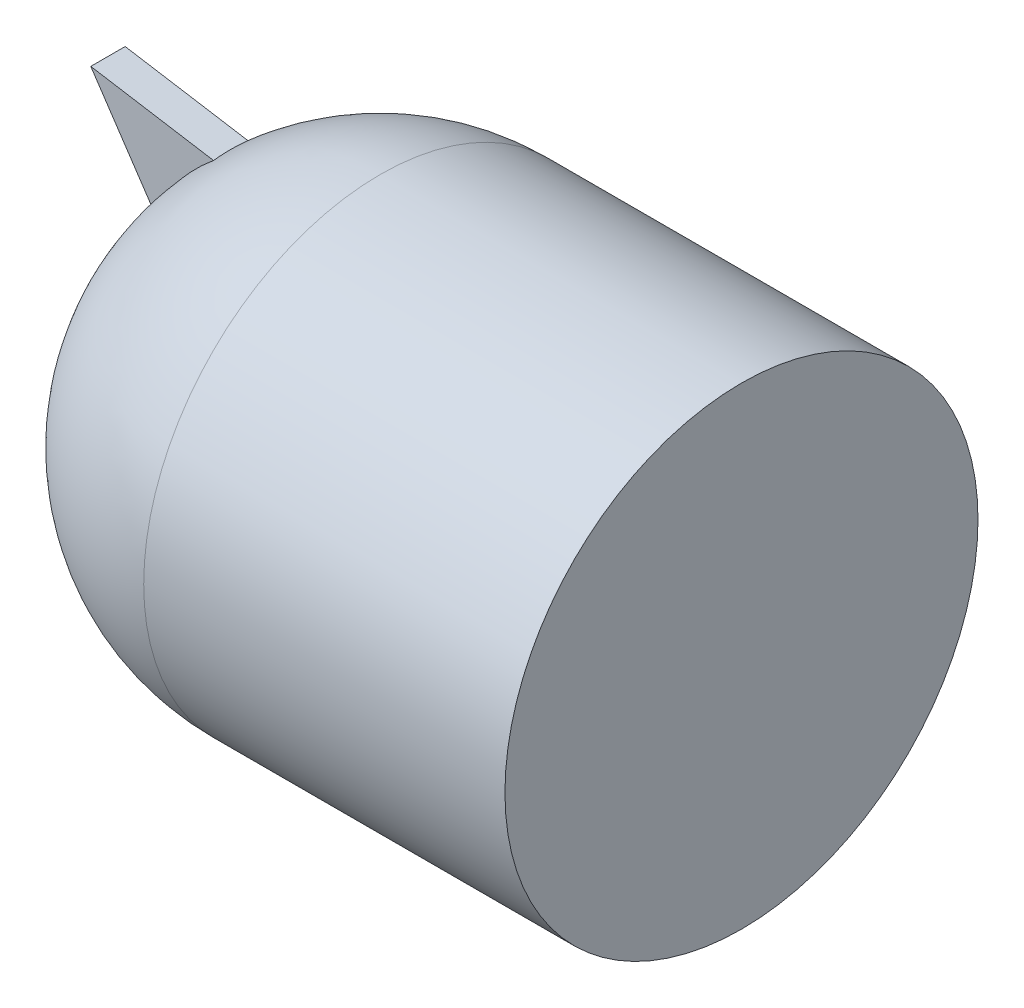
ISO-10303-21;
HEADER;
FILE_DESCRIPTION(('STEP AP214'),'2;1');
FILE_NAME('part.step','',(''),(''),'','','');
FILE_SCHEMA(('AUTOMOTIVE_DESIGN { 1 0 10303 214 1 1 1 1 }'));
ENDSEC;
DATA;
#1=APPLICATION_CONTEXT('core data for automotive mechanical design processes');
#2=APPLICATION_PROTOCOL_DEFINITION('international standard','automotive_design',2000,#1);
#3=PRODUCT_CONTEXT('',#1,'mechanical');
#4=PRODUCT('Part','Part','',(#3));
#5=PRODUCT_RELATED_PRODUCT_CATEGORY('part','',(#4));
#6=PRODUCT_DEFINITION_FORMATION('','',#4);
#7=PRODUCT_DEFINITION_CONTEXT('part definition',#1,'design');
#8=PRODUCT_DEFINITION('design','',#6,#7);
#9=PRODUCT_DEFINITION_SHAPE('','',#8);
#10=(LENGTH_UNIT() NAMED_UNIT(*) SI_UNIT(.MILLI.,.METRE.));
#11=(NAMED_UNIT(*) PLANE_ANGLE_UNIT() SI_UNIT($,.RADIAN.));
#12=(NAMED_UNIT(*) SI_UNIT($,.STERADIAN.) SOLID_ANGLE_UNIT());
#13=UNCERTAINTY_MEASURE_WITH_UNIT(LENGTH_MEASURE(1.E-05),#10,'distance_accuracy_value','');
#14=(GEOMETRIC_REPRESENTATION_CONTEXT(3) GLOBAL_UNCERTAINTY_ASSIGNED_CONTEXT((#13)) GLOBAL_UNIT_ASSIGNED_CONTEXT((#10,
#11,#12)) REPRESENTATION_CONTEXT('',''));
#15=CARTESIAN_POINT('',(0.,0.,0.));
#16=DIRECTION('',(0.,0.,1.));
#17=DIRECTION('',(1.,0.,0.));
#18=AXIS2_PLACEMENT_3D('',#15,#16,#17);
#19=CARTESIAN_POINT('',(-200.,0.,0.));
#20=DIRECTION('',(1.,0.,0.));
#21=DIRECTION('',(0.,1.,0.));
#22=AXIS2_PLACEMENT_3D('',#19,#20,#21);
#23=SPHERICAL_SURFACE('',#22,137.5);
#24=CARTESIAN_POINT('',(-200.,0.,-10.));
#25=DIRECTION('',(0.,0.,-1.));
#26=DIRECTION('',(-1.,0.,0.));
#27=AXIS2_PLACEMENT_3D('',#24,#25,#26);
#28=CIRCLE('',#27,137.135881519025);
#29=CARTESIAN_POINT('',(-286.906992822898,106.082159661655,-10.));
#30=VERTEX_POINT('',#29);
#31=CARTESIAN_POINT('',(-321.664631557291,63.2769107023147,-10.));
#32=VERTEX_POINT('',#31);
#33=EDGE_CURVE('E252',#30,#32,#28,.F.);
#34=ORIENTED_EDGE('',*,*,#33,.F.);
#35=CARTESIAN_POINT('',(-185.340871409232,89.4345588531978,0.));
#36=DIRECTION('',(0.161750586731724,0.986831671407005,0.));
#37=DIRECTION('',(-0.986831671407005,0.161750586731724,0.));
#38=AXIS2_PLACEMENT_3D('',#35,#36,#37);
#39=CIRCLE('',#38,103.406090882951);
#40=CARTESIAN_POINT('',(-286.906992822898,106.082159661655,10.));
#41=VERTEX_POINT('',#40);
#42=EDGE_CURVE('E255',#41,#30,#39,.F.);
#43=ORIENTED_EDGE('',*,*,#42,.F.);
#44=CARTESIAN_POINT('',(-200.,0.,10.));
#45=DIRECTION('',(0.,0.,-1.));
#46=DIRECTION('',(-1.,0.,0.));
#47=AXIS2_PLACEMENT_3D('',#44,#45,#46);
#48=CIRCLE('',#47,137.135881519025);
#49=CARTESIAN_POINT('',(-321.664631557291,63.2769107023147,10.));
#50=VERTEX_POINT('',#49);
#51=EDGE_CURVE('E248',#41,#50,#48,.F.);
#52=ORIENTED_EDGE('',*,*,#51,.T.);
#53=CARTESIAN_POINT('',(-254.551730415217,-36.6412396356591,0.));
#54=DIRECTION('',(-0.830124994956736,-0.557577342391241,0.));
#55=DIRECTION('',(0.557577342391242,-0.830124994956736,0.));
#56=AXIS2_PLACEMENT_3D('',#53,#54,#55);
#57=CIRCLE('',#56,120.779875255225);
#58=EDGE_CURVE('E258',#32,#50,#57,.F.);
#59=ORIENTED_EDGE('',*,*,#58,.F.);
#60=EDGE_LOOP('',(#34,#43,#52,#59));
#61=FACE_BOUND('',#60,.T.);
#62=CARTESIAN_POINT('',(-200.,0.,-10.));
#63=DIRECTION('',(0.,0.,-1.));
#64=DIRECTION('',(-1.,0.,0.));
#65=AXIS2_PLACEMENT_3D('',#62,#63,#64);
#66=CIRCLE('',#65,137.135881519025);
#67=CARTESIAN_POINT('',(-321.664631557291,-63.2769107023148,-10.));
#68=VERTEX_POINT('',#67);
#69=CARTESIAN_POINT('',(-286.906992822898,-106.082159661655,-10.));
#70=VERTEX_POINT('',#69);
#71=EDGE_CURVE('E239',#68,#70,#66,.F.);
#72=ORIENTED_EDGE('',*,*,#71,.F.);
#73=CARTESIAN_POINT('',(-254.551730415217,36.641239635659,0.));
#74=DIRECTION('',(-0.830124994956736,0.557577342391241,0.));
#75=DIRECTION('',(-0.557577342391241,-0.830124994956736,0.));
#76=AXIS2_PLACEMENT_3D('',#73,#74,#75);
#77=CIRCLE('',#76,120.779875255225);
#78=CARTESIAN_POINT('',(-321.664631557291,-63.2769107023148,10.));
#79=VERTEX_POINT('',#78);
#80=EDGE_CURVE('E245',#79,#68,#77,.F.);
#81=ORIENTED_EDGE('',*,*,#80,.F.);
#82=CARTESIAN_POINT('',(-200.,0.,10.));
#83=DIRECTION('',(0.,0.,-1.));
#84=DIRECTION('',(-1.,0.,0.));
#85=AXIS2_PLACEMENT_3D('',#82,#83,#84);
#86=CIRCLE('',#85,137.135881519025);
#87=CARTESIAN_POINT('',(-286.906992822898,-106.082159661655,10.));
#88=VERTEX_POINT('',#87);
#89=EDGE_CURVE('E200',#79,#88,#86,.F.);
#90=ORIENTED_EDGE('',*,*,#89,.T.);
#91=CARTESIAN_POINT('',(-185.340871409232,-89.4345588531979,0.));
#92=DIRECTION('',(0.161750586731724,-0.986831671407005,0.));
#93=DIRECTION('',(0.986831671407005,0.161750586731724,0.));
#94=AXIS2_PLACEMENT_3D('',#91,#92,#93);
#95=CIRCLE('',#94,103.406090882951);
#96=EDGE_CURVE('E242',#70,#88,#95,.F.);
#97=ORIENTED_EDGE('',*,*,#96,.F.);
#98=EDGE_LOOP('',(#72,#81,#90,#97));
#99=FACE_BOUND('',#98,.T.);
#100=CARTESIAN_POINT('',(-200.,0.,0.));
#101=DIRECTION('',(1.,0.,0.));
#102=DIRECTION('',(0.,1.,0.));
#103=AXIS2_PLACEMENT_3D('',#100,#101,#102);
#104=CIRCLE('',#103,137.5);
#105=CARTESIAN_POINT('',(-200.,137.5,0.));
#106=VERTEX_POINT('',#105);
#107=EDGE_CURVE('E261',#106,#106,#104,.T.);
#108=ORIENTED_EDGE('',*,*,#107,.F.);
#109=EDGE_LOOP('',(#108));
#110=FACE_BOUND('',#109,.T.);
#111=ADVANCED_FACE('F46',(#61,#99,#110),#23,.T.);
#112=CARTESIAN_POINT('',(9.99999999999999,127.5,0.));
#113=DIRECTION('',(1.,0.,0.));
#114=DIRECTION('',(0.,1.,0.));
#115=AXIS2_PLACEMENT_3D('',#112,#113,#114);
#116=PLANE('',#115);
#117=CARTESIAN_POINT('',(10.,0.,0.));
#118=DIRECTION('',(1.,0.,0.));
#119=DIRECTION('',(0.,1.,0.));
#120=AXIS2_PLACEMENT_3D('',#117,#118,#119);
#121=CIRCLE('',#120,137.5);
#122=CARTESIAN_POINT('',(10.,137.5,0.));
#123=VERTEX_POINT('',#122);
#124=EDGE_CURVE('E265',#123,#123,#121,.T.);
#125=ORIENTED_EDGE('',*,*,#124,.T.);
#126=EDGE_LOOP('',(#125));
#127=FACE_BOUND('',#126,.T.);
#128=ADVANCED_FACE('F338',(#127),#116,.T.);
#129=CARTESIAN_POINT('',(0.,0.,0.));
#130=DIRECTION('',(1.,0.,0.));
#131=DIRECTION('',(0.,1.,0.));
#132=AXIS2_PLACEMENT_3D('',#129,#130,#131);
#133=CYLINDRICAL_SURFACE('',#132,137.5);
#134=ORIENTED_EDGE('',*,*,#107,.T.);
#135=EDGE_LOOP('',(#134));
#136=FACE_BOUND('',#135,.T.);
#137=ORIENTED_EDGE('',*,*,#124,.F.);
#138=EDGE_LOOP('',(#137));
#139=FACE_BOUND('',#138,.T.);
#140=ADVANCED_FACE('F341',(#136,#139),#133,.T.);
#141=CARTESIAN_POINT('',(-302.602669679641,-34.8973303203591,-10.));
#142=DIRECTION('',(-0.830124994956736,0.557577342391241,0.));
#143=DIRECTION('',(-0.557577342391241,-0.830124994956736,0.));
#144=AXIS2_PLACEMENT_3D('',#141,#142,#143);
#145=PLANE('',#144);
#146=DIRECTION('',(-0.557577342391241,-0.830124994956736,0.));
#147=VECTOR('',#146,1.);
#148=CARTESIAN_POINT('',(-302.602669679641,-34.8973303203591,10.));
#149=LINE('',#148,#147);
#150=CARTESIAN_POINT('',(-358.272990838099,-117.779688618336,10.));
#151=VERTEX_POINT('',#150);
#152=EDGE_CURVE('E182',#79,#151,#149,.T.);
#153=ORIENTED_EDGE('',*,*,#152,.F.);
#154=ORIENTED_EDGE('',*,*,#80,.T.);
#155=DIRECTION('',(-0.557577342391241,-0.830124994956736,0.));
#156=VECTOR('',#155,1.);
#157=CARTESIAN_POINT('',(-302.602669679641,-34.8973303203591,-10.));
#158=LINE('',#157,#156);
#159=CARTESIAN_POINT('',(-358.272990838099,-117.779688618336,-10.));
#160=VERTEX_POINT('',#159);
#161=EDGE_CURVE('E224',#68,#160,#158,.T.);
#162=ORIENTED_EDGE('',*,*,#161,.T.);
#163=DIRECTION('',(0.,0.,1.));
#164=VECTOR('',#163,1.);
#165=CARTESIAN_POINT('',(-358.272990838099,-117.779688618336,-10.));
#166=LINE('',#165,#164);
#167=EDGE_CURVE('E204',#160,#151,#166,.T.);
#168=ORIENTED_EDGE('',*,*,#167,.T.);
#169=EDGE_LOOP('',(#153,#154,#162,#168));
#170=FACE_BOUND('',#169,.T.);
#171=ADVANCED_FACE('F345',(#170),#145,.T.);
#172=CARTESIAN_POINT('',(-358.272990838099,-117.779688618336,-10.));
#173=DIRECTION('',(0.161750586731724,-0.986831671407005,0.));
#174=DIRECTION('',(0.986831671407005,0.161750586731724,0.));
#175=AXIS2_PLACEMENT_3D('',#172,#173,#174);
#176=PLANE('',#175);
#177=DIRECTION('',(0.986831671407005,0.161750586731724,0.));
#178=VECTOR('',#177,1.);
#179=CARTESIAN_POINT('',(-358.272990838099,-117.779688618336,-10.));
#180=LINE('',#179,#178);
#181=EDGE_CURVE('E220',#160,#70,#180,.T.);
#182=ORIENTED_EDGE('',*,*,#181,.T.);
#183=ORIENTED_EDGE('',*,*,#96,.T.);
#184=DIRECTION('',(0.986831671407005,0.161750586731724,0.));
#185=VECTOR('',#184,1.);
#186=CARTESIAN_POINT('',(-358.272990838099,-117.779688618336,10.));
#187=LINE('',#186,#185);
#188=EDGE_CURVE('E70',#151,#88,#187,.T.);
#189=ORIENTED_EDGE('',*,*,#188,.F.);
#190=ORIENTED_EDGE('',*,*,#167,.F.);
#191=EDGE_LOOP('',(#182,#183,#189,#190));
#192=FACE_BOUND('',#191,.T.);
#193=ADVANCED_FACE('F355',(#192),#176,.T.);
#194=CARTESIAN_POINT('',(0.,0.,-10.));
#195=DIRECTION('',(0.,0.,-1.));
#196=DIRECTION('',(-1.,0.,0.));
#197=AXIS2_PLACEMENT_3D('',#194,#195,#196);
#198=PLANE('',#197);
#199=ORIENTED_EDGE('',*,*,#161,.F.);
#200=ORIENTED_EDGE('',*,*,#71,.T.);
#201=ORIENTED_EDGE('',*,*,#181,.F.);
#202=EDGE_LOOP('',(#199,#200,#201));
#203=FACE_BOUND('',#202,.T.);
#204=ADVANCED_FACE('F351',(#203),#198,.T.);
#205=CARTESIAN_POINT('',(0.,0.,10.));
#206=DIRECTION('',(0.,0.,-1.));
#207=DIRECTION('',(-1.,0.,0.));
#208=AXIS2_PLACEMENT_3D('',#205,#206,#207);
#209=PLANE('',#208);
#210=ORIENTED_EDGE('',*,*,#89,.F.);
#211=ORIENTED_EDGE('',*,*,#152,.T.);
#212=ORIENTED_EDGE('',*,*,#188,.T.);
#213=EDGE_LOOP('',(#210,#211,#212));
#214=FACE_BOUND('',#213,.T.);
#215=ADVANCED_FACE('F347',(#214),#209,.F.);
#216=CARTESIAN_POINT('',(-302.602669679641,34.8973303203591,-10.));
#217=DIRECTION('',(-0.830124994956736,-0.557577342391241,0.));
#218=DIRECTION('',(0.557577342391242,-0.830124994956736,0.));
#219=AXIS2_PLACEMENT_3D('',#216,#217,#218);
#220=PLANE('',#219);
#221=DIRECTION('',(0.557577342391241,-0.830124994956736,0.));
#222=VECTOR('',#221,1.);
#223=CARTESIAN_POINT('',(-302.602669679641,34.8973303203591,-10.));
#224=LINE('',#223,#222);
#225=CARTESIAN_POINT('',(-358.272990838099,117.779688618336,-10.));
#226=VERTEX_POINT('',#225);
#227=EDGE_CURVE('E160',#226,#32,#224,.T.);
#228=ORIENTED_EDGE('',*,*,#227,.T.);
#229=ORIENTED_EDGE('',*,*,#58,.T.);
#230=DIRECTION('',(0.557577342391241,-0.830124994956736,0.));
#231=VECTOR('',#230,1.);
#232=CARTESIAN_POINT('',(-302.602669679641,34.8973303203591,10.));
#233=LINE('',#232,#231);
#234=CARTESIAN_POINT('',(-358.272990838099,117.779688618336,10.));
#235=VERTEX_POINT('',#234);
#236=EDGE_CURVE('E62',#235,#50,#233,.T.);
#237=ORIENTED_EDGE('',*,*,#236,.F.);
#238=DIRECTION('',(0.,0.,1.));
#239=VECTOR('',#238,1.);
#240=CARTESIAN_POINT('',(-358.272990838099,117.779688618336,-10.));
#241=LINE('',#240,#239);
#242=EDGE_CURVE('E159',#226,#235,#241,.T.);
#243=ORIENTED_EDGE('',*,*,#242,.F.);
#244=EDGE_LOOP('',(#228,#229,#237,#243));
#245=FACE_BOUND('',#244,.T.);
#246=ADVANCED_FACE('F350',(#245),#220,.T.);
#247=CARTESIAN_POINT('',(-358.272990838099,117.779688618336,-10.));
#248=DIRECTION('',(0.161750586731724,0.986831671407005,0.));
#249=DIRECTION('',(-0.986831671407005,0.161750586731724,0.));
#250=AXIS2_PLACEMENT_3D('',#247,#248,#249);
#251=PLANE('',#250);
#252=DIRECTION('',(-0.986831671407005,0.161750586731724,0.));
#253=VECTOR('',#252,1.);
#254=CARTESIAN_POINT('',(-358.272990838099,117.779688618336,10.));
#255=LINE('',#254,#253);
#256=EDGE_CURVE('E171',#41,#235,#255,.T.);
#257=ORIENTED_EDGE('',*,*,#256,.F.);
#258=ORIENTED_EDGE('',*,*,#42,.T.);
#259=DIRECTION('',(-0.986831671407005,0.161750586731724,0.));
#260=VECTOR('',#259,1.);
#261=CARTESIAN_POINT('',(-358.272990838099,117.779688618336,-10.));
#262=LINE('',#261,#260);
#263=EDGE_CURVE('E189',#30,#226,#262,.T.);
#264=ORIENTED_EDGE('',*,*,#263,.T.);
#265=ORIENTED_EDGE('',*,*,#242,.T.);
#266=EDGE_LOOP('',(#257,#258,#264,#265));
#267=FACE_BOUND('',#266,.T.);
#268=ADVANCED_FACE('F317',(#267),#251,.T.);
#269=CARTESIAN_POINT('',(0.,0.,-10.));
#270=DIRECTION('',(0.,0.,-1.));
#271=DIRECTION('',(-1.,0.,0.));
#272=AXIS2_PLACEMENT_3D('',#269,#270,#271);
#273=PLANE('',#272);
#274=ORIENTED_EDGE('',*,*,#263,.F.);
#275=ORIENTED_EDGE('',*,*,#33,.T.);
#276=ORIENTED_EDGE('',*,*,#227,.F.);
#277=EDGE_LOOP('',(#274,#275,#276));
#278=FACE_BOUND('',#277,.T.);
#279=ADVANCED_FACE('F310',(#278),#273,.T.);
#280=CARTESIAN_POINT('',(0.,0.,10.));
#281=DIRECTION('',(0.,0.,-1.));
#282=DIRECTION('',(-1.,0.,0.));
#283=AXIS2_PLACEMENT_3D('',#280,#281,#282);
#284=PLANE('',#283);
#285=ORIENTED_EDGE('',*,*,#51,.F.);
#286=ORIENTED_EDGE('',*,*,#256,.T.);
#287=ORIENTED_EDGE('',*,*,#236,.T.);
#288=EDGE_LOOP('',(#285,#286,#287));
#289=FACE_BOUND('',#288,.T.);
#290=ADVANCED_FACE('F319',(#289),#284,.F.);
#291=CLOSED_SHELL('',(#111,#128,#140,#171,#193,#204,#215,#246,#268,#279,#290));
#292=CARTESIAN_POINT('',(-200.,0.,0.));
#293=DIRECTION('',(1.,0.,0.));
#294=DIRECTION('',(0.,1.,0.));
#295=AXIS2_PLACEMENT_3D('',#292,#293,#294);
#296=SPHERICAL_SURFACE('',#295,127.5);
#297=CARTESIAN_POINT('',(-185.340871409232,89.4345588531978,0.));
#298=DIRECTION('',(0.161750586731724,0.986831671407005,0.));
#299=DIRECTION('',(-0.986831671407005,0.161750586731724,0.));
#300=AXIS2_PLACEMENT_3D('',#297,#298,#299);
#301=CIRCLE('',#300,89.6817686695195);
#302=CARTESIAN_POINT('',(-273.289774970515,103.8501751793,10.));
#303=VERTEX_POINT('',#302);
#304=CARTESIAN_POINT('',(-273.289774970515,103.8501751793,-10.));
#305=VERTEX_POINT('',#304);
#306=EDGE_CURVE('E166',#303,#305,#301,.F.);
#307=ORIENTED_EDGE('',*,*,#306,.T.);
#308=CARTESIAN_POINT('',(-200.,0.,-10.));
#309=DIRECTION('',(0.,0.,-1.));
#310=DIRECTION('',(-1.,0.,0.));
#311=AXIS2_PLACEMENT_3D('',#308,#309,#310);
#312=CIRCLE('',#311,127.107238188862);
#313=CARTESIAN_POINT('',(-315.217012034306,53.6776502642081,-10.));
#314=VERTEX_POINT('',#313);
#315=EDGE_CURVE('E11',#305,#314,#312,.F.);
#316=ORIENTED_EDGE('',*,*,#315,.T.);
#317=CARTESIAN_POINT('',(-254.551730415217,-36.6412396356591,0.));
#318=DIRECTION('',(-0.830124994956736,-0.557577342391241,0.));
#319=DIRECTION('',(0.557577342391242,-0.830124994956736,0.));
#320=AXIS2_PLACEMENT_3D('',#317,#318,#319);
#321=CIRCLE('',#320,109.260140337946);
#322=CARTESIAN_POINT('',(-315.217012034306,53.6776502642081,10.));
#323=VERTEX_POINT('',#322);
#324=EDGE_CURVE('E55',#314,#323,#321,.F.);
#325=ORIENTED_EDGE('',*,*,#324,.T.);
#326=CARTESIAN_POINT('',(-200.,0.,10.));
#327=DIRECTION('',(0.,0.,-1.));
#328=DIRECTION('',(-1.,0.,0.));
#329=AXIS2_PLACEMENT_3D('',#326,#327,#328);
#330=CIRCLE('',#329,127.107238188862);
#331=EDGE_CURVE('E290',#303,#323,#330,.F.);
#332=ORIENTED_EDGE('',*,*,#331,.F.);
#333=EDGE_LOOP('',(#307,#316,#325,#332));
#334=FACE_BOUND('',#333,.T.);
#335=CARTESIAN_POINT('',(-254.551730415217,36.641239635659,0.));
#336=DIRECTION('',(-0.830124994956736,0.557577342391241,0.));
#337=DIRECTION('',(-0.557577342391241,-0.830124994956736,0.));
#338=AXIS2_PLACEMENT_3D('',#335,#336,#337);
#339=CIRCLE('',#338,109.260140337946);
#340=CARTESIAN_POINT('',(-315.217012034306,-53.6776502642082,10.));
#341=VERTEX_POINT('',#340);
#342=CARTESIAN_POINT('',(-315.217012034306,-53.6776502642082,-10.));
#343=VERTEX_POINT('',#342);
#344=EDGE_CURVE('E284',#341,#343,#339,.F.);
#345=ORIENTED_EDGE('',*,*,#344,.T.);
#346=CARTESIAN_POINT('',(-200.,0.,-10.));
#347=DIRECTION('',(0.,0.,-1.));
#348=DIRECTION('',(-1.,0.,0.));
#349=AXIS2_PLACEMENT_3D('',#346,#347,#348);
#350=CIRCLE('',#349,127.107238188862);
#351=CARTESIAN_POINT('',(-273.289774970515,-103.8501751793,-10.));
#352=VERTEX_POINT('',#351);
#353=EDGE_CURVE('E287',#343,#352,#350,.F.);
#354=ORIENTED_EDGE('',*,*,#353,.T.);
#355=CARTESIAN_POINT('',(-185.340871409232,-89.4345588531979,0.));
#356=DIRECTION('',(0.161750586731724,-0.986831671407005,0.));
#357=DIRECTION('',(0.986831671407005,0.161750586731724,0.));
#358=AXIS2_PLACEMENT_3D('',#355,#356,#357);
#359=CIRCLE('',#358,89.6817686695196);
#360=CARTESIAN_POINT('',(-273.289774970515,-103.8501751793,10.));
#361=VERTEX_POINT('',#360);
#362=EDGE_CURVE('E281',#352,#361,#359,.F.);
#363=ORIENTED_EDGE('',*,*,#362,.T.);
#364=CARTESIAN_POINT('',(-200.,0.,10.));
#365=DIRECTION('',(0.,0.,-1.));
#366=DIRECTION('',(-1.,0.,0.));
#367=AXIS2_PLACEMENT_3D('',#364,#365,#366);
#368=CIRCLE('',#367,127.107238188862);
#369=EDGE_CURVE('E277',#341,#361,#368,.F.);
#370=ORIENTED_EDGE('',*,*,#369,.F.);
#371=EDGE_LOOP('',(#345,#354,#363,#370));
#372=FACE_BOUND('',#371,.T.);
#373=CARTESIAN_POINT('',(-200.,0.,0.));
#374=DIRECTION('',(1.,0.,0.));
#375=DIRECTION('',(0.,1.,0.));
#376=AXIS2_PLACEMENT_3D('',#373,#374,#375);
#377=CIRCLE('',#376,127.5);
#378=CARTESIAN_POINT('',(-200.,127.5,0.));
#379=VERTEX_POINT('',#378);
#380=EDGE_CURVE('E273',#379,#379,#377,.T.);
#381=ORIENTED_EDGE('',*,*,#380,.T.);
#382=EDGE_LOOP('',(#381));
#383=FACE_BOUND('',#382,.T.);
#384=ADVANCED_FACE('F297',(#334,#372,#383),#296,.F.);
#385=CARTESIAN_POINT('',(0.,0.,0.));
#386=DIRECTION('',(1.,0.,0.));
#387=DIRECTION('',(0.,1.,0.));
#388=AXIS2_PLACEMENT_3D('',#385,#386,#387);
#389=CYLINDRICAL_SURFACE('',#388,127.5);
#390=ORIENTED_EDGE('',*,*,#380,.F.);
#391=EDGE_LOOP('',(#390));
#392=FACE_BOUND('',#391,.T.);
#393=CARTESIAN_POINT('',(0.,0.,0.));
#394=DIRECTION('',(1.,0.,0.));
#395=DIRECTION('',(0.,1.,0.));
#396=AXIS2_PLACEMENT_3D('',#393,#394,#395);
#397=CIRCLE('',#396,127.5);
#398=CARTESIAN_POINT('',(0.,127.5,0.));
#399=VERTEX_POINT('',#398);
#400=EDGE_CURVE('E269',#399,#399,#397,.T.);
#401=ORIENTED_EDGE('',*,*,#400,.T.);
#402=EDGE_LOOP('',(#401));
#403=FACE_BOUND('',#402,.T.);
#404=ADVANCED_FACE('F324',(#392,#403),#389,.F.);
#405=CARTESIAN_POINT('',(0.,127.5,0.));
#406=DIRECTION('',(1.,0.,0.));
#407=DIRECTION('',(0.,1.,0.));
#408=AXIS2_PLACEMENT_3D('',#405,#406,#407);
#409=PLANE('',#408);
#410=ORIENTED_EDGE('',*,*,#400,.F.);
#411=EDGE_LOOP('',(#410));
#412=FACE_BOUND('',#411,.T.);
#413=ADVANCED_FACE('F330',(#412),#409,.F.);
#414=CARTESIAN_POINT('',(-239.232172231446,-98.2678277685545,-10.));
#415=DIRECTION('',(0.707106781186548,0.707106781186547,0.));
#416=DIRECTION('',(-0.707106781186547,0.707106781186548,0.));
#417=AXIS2_PLACEMENT_3D('',#414,#415,#416);
#418=PLANE('',#417);
#419=DIRECTION('',(0.,0.,1.));
#420=VECTOR('',#419,1.);
#421=CARTESIAN_POINT('',(-302.602669679641,-34.8973303203591,-10.));
#422=LINE('',#421,#420);
#423=CARTESIAN_POINT('',(-302.602669679641,-34.8973303203591,-10.));
#424=VERTEX_POINT('',#423);
#425=CARTESIAN_POINT('',(-302.602669679641,-34.8973303203591,10.));
#426=VERTEX_POINT('',#425);
#427=EDGE_CURVE('E213',#424,#426,#422,.T.);
#428=ORIENTED_EDGE('',*,*,#427,.T.);
#429=DIRECTION('',(-0.707106781186547,0.707106781186548,0.));
#430=VECTOR('',#429,1.);
#431=CARTESIAN_POINT('',(-239.232172231446,-98.2678277685545,10.));
#432=LINE('',#431,#430);
#433=CARTESIAN_POINT('',(-239.232172231446,-98.2678277685545,10.));
#434=VERTEX_POINT('',#433);
#435=EDGE_CURVE('E229',#434,#426,#432,.T.);
#436=ORIENTED_EDGE('',*,*,#435,.F.);
#437=DIRECTION('',(0.,0.,1.));
#438=VECTOR('',#437,1.);
#439=CARTESIAN_POINT('',(-239.232172231446,-98.2678277685545,-10.));
#440=LINE('',#439,#438);
#441=CARTESIAN_POINT('',(-239.232172231446,-98.2678277685545,-10.));
#442=VERTEX_POINT('',#441);
#443=EDGE_CURVE('E209',#442,#434,#440,.T.);
#444=ORIENTED_EDGE('',*,*,#443,.F.);
#445=DIRECTION('',(-0.707106781186547,0.707106781186548,0.));
#446=VECTOR('',#445,1.);
#447=CARTESIAN_POINT('',(-239.232172231446,-98.2678277685545,-10.));
#448=LINE('',#447,#446);
#449=EDGE_CURVE('E208',#442,#424,#448,.T.);
#450=ORIENTED_EDGE('',*,*,#449,.T.);
#451=EDGE_LOOP('',(#428,#436,#444,#450));
#452=FACE_BOUND('',#451,.T.);
#453=ADVANCED_FACE('F336',(#452),#418,.T.);
#454=EDGE_CURVE('E177',#426,#341,#149,.T.);
#455=ORIENTED_EDGE('',*,*,#454,.T.);
#456=ORIENTED_EDGE('',*,*,#369,.T.);
#457=EDGE_CURVE('E233',#361,#434,#187,.T.);
#458=ORIENTED_EDGE('',*,*,#457,.T.);
#459=ORIENTED_EDGE('',*,*,#435,.T.);
#460=EDGE_LOOP('',(#455,#456,#458,#459));
#461=FACE_BOUND('',#460,.T.);
#462=ADVANCED_FACE('F352',(#461),#209,.F.);
#463=ORIENTED_EDGE('',*,*,#353,.F.);
#464=EDGE_CURVE('E225',#424,#343,#158,.T.);
#465=ORIENTED_EDGE('',*,*,#464,.F.);
#466=ORIENTED_EDGE('',*,*,#449,.F.);
#467=EDGE_CURVE('E219',#352,#442,#180,.T.);
#468=ORIENTED_EDGE('',*,*,#467,.F.);
#469=EDGE_LOOP('',(#463,#465,#466,#468));
#470=FACE_BOUND('',#469,.T.);
#471=ADVANCED_FACE('F357',(#470),#198,.T.);
#472=ORIENTED_EDGE('',*,*,#362,.F.);
#473=ORIENTED_EDGE('',*,*,#467,.T.);
#474=ORIENTED_EDGE('',*,*,#443,.T.);
#475=ORIENTED_EDGE('',*,*,#457,.F.);
#476=EDGE_LOOP('',(#472,#473,#474,#475));
#477=FACE_BOUND('',#476,.T.);
#478=ADVANCED_FACE('F363',(#477),#176,.T.);
#479=ORIENTED_EDGE('',*,*,#344,.F.);
#480=ORIENTED_EDGE('',*,*,#454,.F.);
#481=ORIENTED_EDGE('',*,*,#427,.F.);
#482=ORIENTED_EDGE('',*,*,#464,.T.);
#483=EDGE_LOOP('',(#479,#480,#481,#482));
#484=FACE_BOUND('',#483,.T.);
#485=ADVANCED_FACE('F367',(#484),#145,.T.);
#486=CARTESIAN_POINT('',(-239.232172231446,98.2678277685544,-10.));
#487=DIRECTION('',(0.707106781186549,-0.707106781186547,0.));
#488=DIRECTION('',(0.707106781186546,0.707106781186549,0.));
#489=AXIS2_PLACEMENT_3D('',#486,#487,#488);
#490=PLANE('',#489);
#491=DIRECTION('',(0.,0.,1.));
#492=VECTOR('',#491,1.);
#493=CARTESIAN_POINT('',(-239.232172231446,98.2678277685544,-10.));
#494=LINE('',#493,#492);
#495=CARTESIAN_POINT('',(-239.232172231446,98.2678277685544,-10.));
#496=VERTEX_POINT('',#495);
#497=CARTESIAN_POINT('',(-239.232172231446,98.2678277685544,10.));
#498=VERTEX_POINT('',#497);
#499=EDGE_CURVE('E147',#496,#498,#494,.T.);
#500=ORIENTED_EDGE('',*,*,#499,.T.);
#501=DIRECTION('',(0.707106781186547,0.707106781186549,0.));
#502=VECTOR('',#501,1.);
#503=CARTESIAN_POINT('',(-239.232172231446,98.2678277685544,10.));
#504=LINE('',#503,#502);
#505=CARTESIAN_POINT('',(-302.602669679641,34.8973303203591,10.));
#506=VERTEX_POINT('',#505);
#507=EDGE_CURVE('E152',#506,#498,#504,.T.);
#508=ORIENTED_EDGE('',*,*,#507,.F.);
#509=DIRECTION('',(0.,0.,1.));
#510=VECTOR('',#509,1.);
#511=CARTESIAN_POINT('',(-302.602669679641,34.8973303203591,-10.));
#512=LINE('',#511,#510);
#513=CARTESIAN_POINT('',(-302.602669679641,34.8973303203591,-10.));
#514=VERTEX_POINT('',#513);
#515=EDGE_CURVE('E197',#514,#506,#512,.T.);
#516=ORIENTED_EDGE('',*,*,#515,.F.);
#517=DIRECTION('',(0.707106781186547,0.707106781186549,0.));
#518=VECTOR('',#517,1.);
#519=CARTESIAN_POINT('',(-239.232172231446,98.2678277685544,-10.));
#520=LINE('',#519,#518);
#521=EDGE_CURVE('E154',#514,#496,#520,.T.);
#522=ORIENTED_EDGE('',*,*,#521,.T.);
#523=EDGE_LOOP('',(#500,#508,#516,#522));
#524=FACE_BOUND('',#523,.T.);
#525=ADVANCED_FACE('F149',(#524),#490,.T.);
#526=EDGE_CURVE('E164',#498,#303,#255,.T.);
#527=ORIENTED_EDGE('',*,*,#526,.T.);
#528=ORIENTED_EDGE('',*,*,#331,.T.);
#529=EDGE_CURVE('E170',#323,#506,#233,.T.);
#530=ORIENTED_EDGE('',*,*,#529,.T.);
#531=ORIENTED_EDGE('',*,*,#507,.T.);
#532=EDGE_LOOP('',(#527,#528,#530,#531));
#533=FACE_BOUND('',#532,.T.);
#534=ADVANCED_FACE('F173',(#533),#284,.F.);
#535=ORIENTED_EDGE('',*,*,#315,.F.);
#536=EDGE_CURVE('E190',#496,#305,#262,.T.);
#537=ORIENTED_EDGE('',*,*,#536,.F.);
#538=ORIENTED_EDGE('',*,*,#521,.F.);
#539=EDGE_CURVE('E193',#314,#514,#224,.T.);
#540=ORIENTED_EDGE('',*,*,#539,.F.);
#541=EDGE_LOOP('',(#535,#537,#538,#540));
#542=FACE_BOUND('',#541,.T.);
#543=ADVANCED_FACE('F307',(#542),#273,.T.);
#544=ORIENTED_EDGE('',*,*,#306,.F.);
#545=ORIENTED_EDGE('',*,*,#526,.F.);
#546=ORIENTED_EDGE('',*,*,#499,.F.);
#547=ORIENTED_EDGE('',*,*,#536,.T.);
#548=EDGE_LOOP('',(#544,#545,#546,#547));
#549=FACE_BOUND('',#548,.T.);
#550=ADVANCED_FACE('F165',(#549),#251,.T.);
#551=ORIENTED_EDGE('',*,*,#324,.F.);
#552=ORIENTED_EDGE('',*,*,#539,.T.);
#553=ORIENTED_EDGE('',*,*,#515,.T.);
#554=ORIENTED_EDGE('',*,*,#529,.F.);
#555=EDGE_LOOP('',(#551,#552,#553,#554));
#556=FACE_BOUND('',#555,.T.);
#557=ADVANCED_FACE('F302',(#556),#220,.T.);
#558=CLOSED_SHELL('',(#384,#404,#413,#453,#462,#471,#478,#485,#525,#534,#543,#550,#557));
#559=ORIENTED_CLOSED_SHELL('',*,#558,.T.);
#560=BREP_WITH_VOIDS('B2',#291,(#559));
#561=ADVANCED_BREP_SHAPE_REPRESENTATION('',(#18,#560),#14);
#562=SHAPE_DEFINITION_REPRESENTATION(#9,#561);
ENDSEC;
END-ISO-10303-21;
